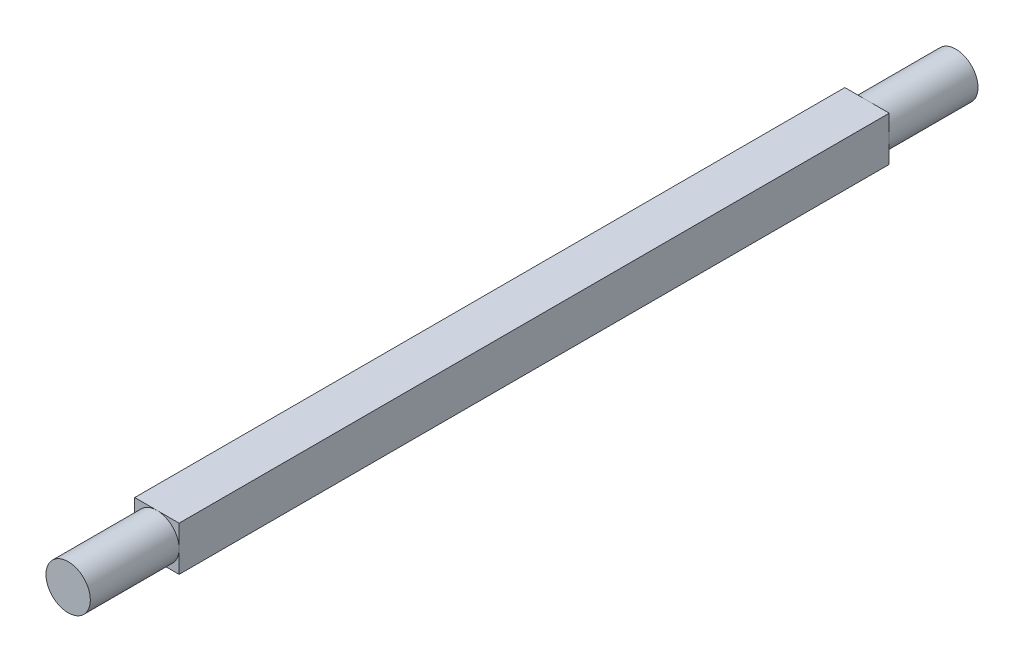
ISO-10303-21;
HEADER;
FILE_DESCRIPTION(('STEP AP214'),'2;1');
FILE_NAME('part.step','',(''),(''),'','','');
FILE_SCHEMA(('AUTOMOTIVE_DESIGN { 1 0 10303 214 1 1 1 1 }'));
ENDSEC;
DATA;
#1=APPLICATION_CONTEXT('core data for automotive mechanical design processes');
#2=APPLICATION_PROTOCOL_DEFINITION('international standard','automotive_design',2000,#1);
#3=PRODUCT_CONTEXT('',#1,'mechanical');
#4=PRODUCT('Part','Part','',(#3));
#5=PRODUCT_RELATED_PRODUCT_CATEGORY('part','',(#4));
#6=PRODUCT_DEFINITION_FORMATION('','',#4);
#7=PRODUCT_DEFINITION_CONTEXT('part definition',#1,'design');
#8=PRODUCT_DEFINITION('design','',#6,#7);
#9=PRODUCT_DEFINITION_SHAPE('','',#8);
#10=(LENGTH_UNIT() NAMED_UNIT(*) SI_UNIT(.MILLI.,.METRE.));
#11=(NAMED_UNIT(*) PLANE_ANGLE_UNIT() SI_UNIT($,.RADIAN.));
#12=(NAMED_UNIT(*) SI_UNIT($,.STERADIAN.) SOLID_ANGLE_UNIT());
#13=UNCERTAINTY_MEASURE_WITH_UNIT(LENGTH_MEASURE(1.E-05),#10,'distance_accuracy_value','');
#14=(GEOMETRIC_REPRESENTATION_CONTEXT(3) GLOBAL_UNCERTAINTY_ASSIGNED_CONTEXT((#13)) GLOBAL_UNIT_ASSIGNED_CONTEXT((#10,
#11,#12)) REPRESENTATION_CONTEXT('',''));
#15=CARTESIAN_POINT('',(0.,0.,0.));
#16=DIRECTION('',(0.,0.,1.));
#17=DIRECTION('',(1.,0.,0.));
#18=AXIS2_PLACEMENT_3D('',#15,#16,#17);
#19=CARTESIAN_POINT('',(0.,0.,-400.));
#20=DIRECTION('',(0.,0.,1.));
#21=DIRECTION('',(1.,0.,0.));
#22=AXIS2_PLACEMENT_3D('',#19,#20,#21);
#23=PLANE('',#22);
#24=DIRECTION('',(0.,1.,0.));
#25=VECTOR('',#24,1.);
#26=CARTESIAN_POINT('',(25.,25.,-400.));
#27=LINE('',#26,#25);
#28=CARTESIAN_POINT('',(25.,0.,-400.));
#29=VERTEX_POINT('',#28);
#30=CARTESIAN_POINT('',(25.,25.,-400.));
#31=VERTEX_POINT('',#30);
#32=EDGE_CURVE('E114',#29,#31,#27,.T.);
#33=ORIENTED_EDGE('',*,*,#32,.F.);
#34=CARTESIAN_POINT('',(0.,0.,-400.));
#35=DIRECTION('',(0.,0.,1.));
#36=DIRECTION('',(1.,0.,0.));
#37=AXIS2_PLACEMENT_3D('',#34,#35,#36);
#38=CIRCLE('',#37,25.);
#39=CARTESIAN_POINT('',(0.,25.,-400.));
#40=VERTEX_POINT('',#39);
#41=EDGE_CURVE('E49',#29,#40,#38,.T.);
#42=ORIENTED_EDGE('',*,*,#41,.T.);
#43=DIRECTION('',(-1.,0.,0.));
#44=VECTOR('',#43,1.);
#45=CARTESIAN_POINT('',(-25.,25.,-400.));
#46=LINE('',#45,#44);
#47=EDGE_CURVE('E112',#31,#40,#46,.T.);
#48=ORIENTED_EDGE('',*,*,#47,.F.);
#49=EDGE_LOOP('',(#33,#42,#48));
#50=FACE_BOUND('',#49,.T.);
#51=ADVANCED_FACE('F38',(#50),#23,.F.);
#52=CARTESIAN_POINT('',(-25.,25.,-400.));
#53=VERTEX_POINT('',#52);
#54=EDGE_CURVE('E118',#40,#53,#46,.T.);
#55=ORIENTED_EDGE('',*,*,#54,.F.);
#56=CARTESIAN_POINT('',(-25.,0.,-400.));
#57=VERTEX_POINT('',#56);
#58=EDGE_CURVE('E11',#40,#57,#38,.T.);
#59=ORIENTED_EDGE('',*,*,#58,.T.);
#60=DIRECTION('',(0.,-1.,0.));
#61=VECTOR('',#60,1.);
#62=CARTESIAN_POINT('',(-25.,25.,-400.));
#63=LINE('',#62,#61);
#64=EDGE_CURVE('E121',#53,#57,#63,.T.);
#65=ORIENTED_EDGE('',*,*,#64,.F.);
#66=EDGE_LOOP('',(#55,#59,#65));
#67=FACE_BOUND('',#66,.T.);
#68=ADVANCED_FACE('F119',(#67),#23,.F.);
#69=CARTESIAN_POINT('',(-25.,-25.,-400.));
#70=VERTEX_POINT('',#69);
#71=EDGE_CURVE('E130',#57,#70,#63,.T.);
#72=ORIENTED_EDGE('',*,*,#71,.F.);
#73=CARTESIAN_POINT('',(0.,-25.,-400.));
#74=VERTEX_POINT('',#73);
#75=EDGE_CURVE('E47',#57,#74,#38,.T.);
#76=ORIENTED_EDGE('',*,*,#75,.T.);
#77=DIRECTION('',(1.,0.,0.));
#78=VECTOR('',#77,1.);
#79=CARTESIAN_POINT('',(-25.,-25.,-400.));
#80=LINE('',#79,#78);
#81=EDGE_CURVE('E136',#70,#74,#80,.T.);
#82=ORIENTED_EDGE('',*,*,#81,.F.);
#83=EDGE_LOOP('',(#72,#76,#82));
#84=FACE_BOUND('',#83,.T.);
#85=ADVANCED_FACE('F169',(#84),#23,.F.);
#86=CARTESIAN_POINT('',(0.,0.,400.));
#87=DIRECTION('',(0.,0.,1.));
#88=DIRECTION('',(1.,0.,0.));
#89=AXIS2_PLACEMENT_3D('',#86,#87,#88);
#90=PLANE('',#89);
#91=CARTESIAN_POINT('',(0.,0.,400.));
#92=DIRECTION('',(0.,0.,1.));
#93=DIRECTION('',(1.,0.,0.));
#94=AXIS2_PLACEMENT_3D('',#91,#92,#93);
#95=CIRCLE('',#94,25.);
#96=CARTESIAN_POINT('',(25.,0.,400.));
#97=VERTEX_POINT('',#96);
#98=CARTESIAN_POINT('',(0.,25.,400.));
#99=VERTEX_POINT('',#98);
#100=EDGE_CURVE('E151',#97,#99,#95,.T.);
#101=ORIENTED_EDGE('',*,*,#100,.F.);
#102=DIRECTION('',(0.,1.,0.));
#103=VECTOR('',#102,1.);
#104=CARTESIAN_POINT('',(25.,25.,400.));
#105=LINE('',#104,#103);
#106=CARTESIAN_POINT('',(25.,25.,400.));
#107=VERTEX_POINT('',#106);
#108=EDGE_CURVE('E139',#97,#107,#105,.T.);
#109=ORIENTED_EDGE('',*,*,#108,.T.);
#110=DIRECTION('',(-1.,0.,0.));
#111=VECTOR('',#110,1.);
#112=CARTESIAN_POINT('',(-25.,25.,400.));
#113=LINE('',#112,#111);
#114=EDGE_CURVE('E183',#107,#99,#113,.T.);
#115=ORIENTED_EDGE('',*,*,#114,.T.);
#116=EDGE_LOOP('',(#101,#109,#115));
#117=FACE_BOUND('',#116,.T.);
#118=ADVANCED_FACE('F228',(#117),#90,.T.);
#119=CARTESIAN_POINT('',(-25.,0.,400.));
#120=VERTEX_POINT('',#119);
#121=EDGE_CURVE('E155',#99,#120,#95,.T.);
#122=ORIENTED_EDGE('',*,*,#121,.F.);
#123=CARTESIAN_POINT('',(-25.,25.,400.));
#124=VERTEX_POINT('',#123);
#125=EDGE_CURVE('E188',#99,#124,#113,.T.);
#126=ORIENTED_EDGE('',*,*,#125,.T.);
#127=DIRECTION('',(0.,-1.,0.));
#128=VECTOR('',#127,1.);
#129=CARTESIAN_POINT('',(-25.,25.,400.));
#130=LINE('',#129,#128);
#131=EDGE_CURVE('E181',#124,#120,#130,.T.);
#132=ORIENTED_EDGE('',*,*,#131,.T.);
#133=EDGE_LOOP('',(#122,#126,#132));
#134=FACE_BOUND('',#133,.T.);
#135=ADVANCED_FACE('F186',(#134),#90,.T.);
#136=CARTESIAN_POINT('',(0.,-25.,400.));
#137=VERTEX_POINT('',#136);
#138=EDGE_CURVE('E149',#120,#137,#95,.T.);
#139=ORIENTED_EDGE('',*,*,#138,.F.);
#140=CARTESIAN_POINT('',(-25.,-25.,400.));
#141=VERTEX_POINT('',#140);
#142=EDGE_CURVE('E179',#120,#141,#130,.T.);
#143=ORIENTED_EDGE('',*,*,#142,.T.);
#144=DIRECTION('',(1.,0.,0.));
#145=VECTOR('',#144,1.);
#146=CARTESIAN_POINT('',(-25.,-25.,400.));
#147=LINE('',#146,#145);
#148=EDGE_CURVE('E144',#141,#137,#147,.T.);
#149=ORIENTED_EDGE('',*,*,#148,.T.);
#150=EDGE_LOOP('',(#139,#143,#149));
#151=FACE_BOUND('',#150,.T.);
#152=ADVANCED_FACE('F191',(#151),#90,.T.);
#153=CARTESIAN_POINT('',(25.,25.,400.));
#154=DIRECTION('',(-1.,0.,0.));
#155=DIRECTION('',(0.,-1.,0.));
#156=AXIS2_PLACEMENT_3D('',#153,#154,#155);
#157=PLANE('',#156);
#158=CARTESIAN_POINT('',(25.,-25.,-400.));
#159=VERTEX_POINT('',#158);
#160=EDGE_CURVE('E125',#159,#29,#27,.T.);
#161=ORIENTED_EDGE('',*,*,#160,.T.);
#162=ORIENTED_EDGE('',*,*,#32,.T.);
#163=DIRECTION('',(0.,0.,-1.));
#164=VECTOR('',#163,1.);
#165=CARTESIAN_POINT('',(25.,25.,400.));
#166=LINE('',#165,#164);
#167=EDGE_CURVE('E42',#107,#31,#166,.T.);
#168=ORIENTED_EDGE('',*,*,#167,.F.);
#169=ORIENTED_EDGE('',*,*,#108,.F.);
#170=CARTESIAN_POINT('',(25.,-25.,400.));
#171=VERTEX_POINT('',#170);
#172=EDGE_CURVE('E225',#171,#97,#105,.T.);
#173=ORIENTED_EDGE('',*,*,#172,.F.);
#174=DIRECTION('',(0.,0.,-1.));
#175=VECTOR('',#174,1.);
#176=CARTESIAN_POINT('',(25.,-25.,400.));
#177=LINE('',#176,#175);
#178=EDGE_CURVE('E140',#171,#159,#177,.T.);
#179=ORIENTED_EDGE('',*,*,#178,.T.);
#180=EDGE_LOOP('',(#161,#162,#168,#169,#173,#179));
#181=FACE_BOUND('',#180,.T.);
#182=ADVANCED_FACE('F40',(#181),#157,.F.);
#183=CARTESIAN_POINT('',(-25.,25.,400.));
#184=DIRECTION('',(0.,-1.,0.));
#185=DIRECTION('',(0.,0.,-1.));
#186=AXIS2_PLACEMENT_3D('',#183,#184,#185);
#187=PLANE('',#186);
#188=ORIENTED_EDGE('',*,*,#47,.T.);
#189=ORIENTED_EDGE('',*,*,#54,.T.);
#190=DIRECTION('',(0.,0.,-1.));
#191=VECTOR('',#190,1.);
#192=CARTESIAN_POINT('',(-25.,25.,400.));
#193=LINE('',#192,#191);
#194=EDGE_CURVE('E146',#124,#53,#193,.T.);
#195=ORIENTED_EDGE('',*,*,#194,.F.);
#196=ORIENTED_EDGE('',*,*,#125,.F.);
#197=ORIENTED_EDGE('',*,*,#114,.F.);
#198=ORIENTED_EDGE('',*,*,#167,.T.);
#199=EDGE_LOOP('',(#188,#189,#195,#196,#197,#198));
#200=FACE_BOUND('',#199,.T.);
#201=ADVANCED_FACE('F127',(#200),#187,.F.);
#202=CARTESIAN_POINT('',(-25.,25.,400.));
#203=DIRECTION('',(1.,0.,0.));
#204=DIRECTION('',(0.,1.,0.));
#205=AXIS2_PLACEMENT_3D('',#202,#203,#204);
#206=PLANE('',#205);
#207=ORIENTED_EDGE('',*,*,#64,.T.);
#208=ORIENTED_EDGE('',*,*,#71,.T.);
#209=DIRECTION('',(0.,0.,-1.));
#210=VECTOR('',#209,1.);
#211=CARTESIAN_POINT('',(-25.,-25.,400.));
#212=LINE('',#211,#210);
#213=EDGE_CURVE('E143',#141,#70,#212,.T.);
#214=ORIENTED_EDGE('',*,*,#213,.F.);
#215=ORIENTED_EDGE('',*,*,#142,.F.);
#216=ORIENTED_EDGE('',*,*,#131,.F.);
#217=ORIENTED_EDGE('',*,*,#194,.T.);
#218=EDGE_LOOP('',(#207,#208,#214,#215,#216,#217));
#219=FACE_BOUND('',#218,.T.);
#220=ADVANCED_FACE('F178',(#219),#206,.F.);
#221=CARTESIAN_POINT('',(-25.,-25.,400.));
#222=DIRECTION('',(0.,1.,0.));
#223=DIRECTION('',(0.,0.,1.));
#224=AXIS2_PLACEMENT_3D('',#221,#222,#223);
#225=PLANE('',#224);
#226=ORIENTED_EDGE('',*,*,#81,.T.);
#227=EDGE_CURVE('E135',#74,#159,#80,.T.);
#228=ORIENTED_EDGE('',*,*,#227,.T.);
#229=ORIENTED_EDGE('',*,*,#178,.F.);
#230=EDGE_CURVE('E189',#137,#171,#147,.T.);
#231=ORIENTED_EDGE('',*,*,#230,.F.);
#232=ORIENTED_EDGE('',*,*,#148,.F.);
#233=ORIENTED_EDGE('',*,*,#213,.T.);
#234=EDGE_LOOP('',(#226,#228,#229,#231,#232,#233));
#235=FACE_BOUND('',#234,.T.);
#236=ADVANCED_FACE('F173',(#235),#225,.F.);
#237=EDGE_CURVE('E63',#137,#97,#95,.T.);
#238=ORIENTED_EDGE('',*,*,#237,.F.);
#239=ORIENTED_EDGE('',*,*,#230,.T.);
#240=ORIENTED_EDGE('',*,*,#172,.T.);
#241=EDGE_LOOP('',(#238,#239,#240));
#242=FACE_BOUND('',#241,.T.);
#243=ADVANCED_FACE('F203',(#242),#90,.T.);
#244=ORIENTED_EDGE('',*,*,#227,.F.);
#245=EDGE_CURVE('E117',#74,#29,#38,.T.);
#246=ORIENTED_EDGE('',*,*,#245,.T.);
#247=ORIENTED_EDGE('',*,*,#160,.F.);
#248=EDGE_LOOP('',(#244,#246,#247));
#249=FACE_BOUND('',#248,.T.);
#250=ADVANCED_FACE('F170',(#249),#23,.F.);
#251=CARTESIAN_POINT('',(0.,0.,500.));
#252=DIRECTION('',(0.,0.,-1.));
#253=DIRECTION('',(-1.,0.,0.));
#254=AXIS2_PLACEMENT_3D('',#251,#252,#253);
#255=CYLINDRICAL_SURFACE('',#254,25.);
#256=CARTESIAN_POINT('',(0.,0.,500.));
#257=DIRECTION('',(0.,0.,1.));
#258=DIRECTION('',(1.,0.,0.));
#259=AXIS2_PLACEMENT_3D('',#256,#257,#258);
#260=CIRCLE('',#259,25.);
#261=CARTESIAN_POINT('',(25.,0.,500.));
#262=VERTEX_POINT('',#261);
#263=EDGE_CURVE('E158',#262,#262,#260,.T.);
#264=ORIENTED_EDGE('',*,*,#263,.F.);
#265=EDGE_LOOP('',(#264));
#266=FACE_BOUND('',#265,.T.);
#267=ORIENTED_EDGE('',*,*,#100,.T.);
#268=ORIENTED_EDGE('',*,*,#121,.T.);
#269=ORIENTED_EDGE('',*,*,#138,.T.);
#270=ORIENTED_EDGE('',*,*,#237,.T.);
#271=EDGE_LOOP('',(#267,#268,#269,#270));
#272=FACE_BOUND('',#271,.T.);
#273=ADVANCED_FACE('F192',(#266,#272),#255,.T.);
#274=CARTESIAN_POINT('',(0.,0.,500.));
#275=DIRECTION('',(0.,0.,1.));
#276=DIRECTION('',(1.,0.,0.));
#277=AXIS2_PLACEMENT_3D('',#274,#275,#276);
#278=PLANE('',#277);
#279=ORIENTED_EDGE('',*,*,#263,.T.);
#280=EDGE_LOOP('',(#279));
#281=FACE_BOUND('',#280,.T.);
#282=ADVANCED_FACE('F194',(#281),#278,.T.);
#283=CARTESIAN_POINT('',(0.,0.,-500.));
#284=DIRECTION('',(0.,0.,1.));
#285=DIRECTION('',(1.,0.,0.));
#286=AXIS2_PLACEMENT_3D('',#283,#284,#285);
#287=CYLINDRICAL_SURFACE('',#286,25.);
#288=CARTESIAN_POINT('',(0.,0.,-500.));
#289=DIRECTION('',(0.,0.,1.));
#290=DIRECTION('',(1.,0.,0.));
#291=AXIS2_PLACEMENT_3D('',#288,#289,#290);
#292=CIRCLE('',#291,25.);
#293=CARTESIAN_POINT('',(25.,0.,-500.));
#294=VERTEX_POINT('',#293);
#295=EDGE_CURVE('E116',#294,#294,#292,.T.);
#296=ORIENTED_EDGE('',*,*,#295,.T.);
#297=EDGE_LOOP('',(#296));
#298=FACE_BOUND('',#297,.T.);
#299=ORIENTED_EDGE('',*,*,#41,.F.);
#300=ORIENTED_EDGE('',*,*,#245,.F.);
#301=ORIENTED_EDGE('',*,*,#75,.F.);
#302=ORIENTED_EDGE('',*,*,#58,.F.);
#303=EDGE_LOOP('',(#299,#300,#301,#302));
#304=FACE_BOUND('',#303,.T.);
#305=ADVANCED_FACE('F102',(#298,#304),#287,.T.);
#306=CARTESIAN_POINT('',(0.,0.,-500.));
#307=DIRECTION('',(0.,0.,-1.));
#308=DIRECTION('',(1.,0.,0.));
#309=AXIS2_PLACEMENT_3D('',#306,#307,#308);
#310=PLANE('',#309);
#311=ORIENTED_EDGE('',*,*,#295,.F.);
#312=EDGE_LOOP('',(#311));
#313=FACE_BOUND('',#312,.T.);
#314=ADVANCED_FACE('F257',(#313),#310,.T.);
#315=CLOSED_SHELL('',(#51,#68,#85,#118,#135,#152,#182,#201,#220,#236,#243,#250,#273,#282,#305,#314));
#316=MANIFOLD_SOLID_BREP('B2',#315);
#317=ADVANCED_BREP_SHAPE_REPRESENTATION('',(#18,#316),#14);
#318=SHAPE_DEFINITION_REPRESENTATION(#9,#317);
ENDSEC;
END-ISO-10303-21;
